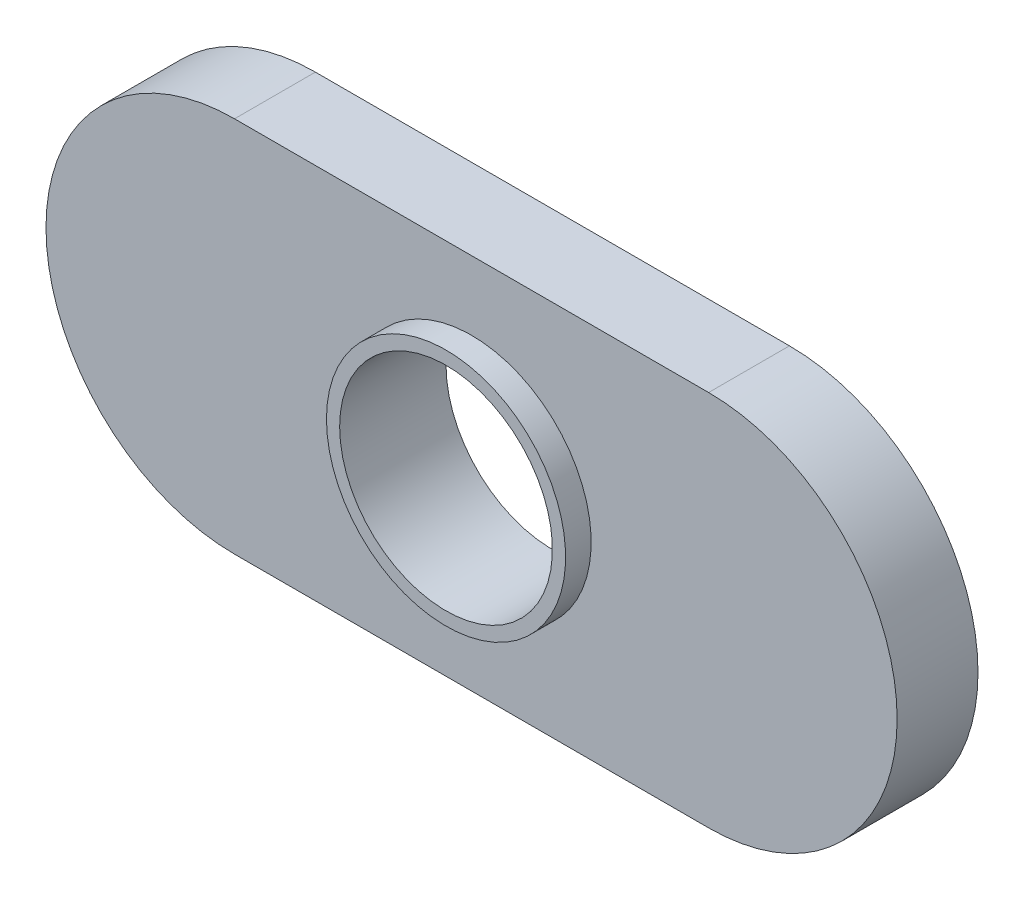
ISO-10303-21;
HEADER;
FILE_DESCRIPTION(('STEP AP214'),'2;1');
FILE_NAME('part.step','',(''),(''),'','','');
FILE_SCHEMA(('AUTOMOTIVE_DESIGN { 1 0 10303 214 1 1 1 1 }'));
ENDSEC;
DATA;
#1=APPLICATION_CONTEXT('core data for automotive mechanical design processes');
#2=APPLICATION_PROTOCOL_DEFINITION('international standard','automotive_design',2000,#1);
#3=PRODUCT_CONTEXT('',#1,'mechanical');
#4=PRODUCT('Part','Part','',(#3));
#5=PRODUCT_RELATED_PRODUCT_CATEGORY('part','',(#4));
#6=PRODUCT_DEFINITION_FORMATION('','',#4);
#7=PRODUCT_DEFINITION_CONTEXT('part definition',#1,'design');
#8=PRODUCT_DEFINITION('design','',#6,#7);
#9=PRODUCT_DEFINITION_SHAPE('','',#8);
#10=(LENGTH_UNIT() NAMED_UNIT(*) SI_UNIT(.MILLI.,.METRE.));
#11=(NAMED_UNIT(*) PLANE_ANGLE_UNIT() SI_UNIT($,.RADIAN.));
#12=(NAMED_UNIT(*) SI_UNIT($,.STERADIAN.) SOLID_ANGLE_UNIT());
#13=UNCERTAINTY_MEASURE_WITH_UNIT(LENGTH_MEASURE(1.E-05),#10,'distance_accuracy_value','');
#14=(GEOMETRIC_REPRESENTATION_CONTEXT(3) GLOBAL_UNCERTAINTY_ASSIGNED_CONTEXT((#13)) GLOBAL_UNIT_ASSIGNED_CONTEXT((#10,
#11,#12)) REPRESENTATION_CONTEXT('',''));
#15=CARTESIAN_POINT('',(0.,0.,0.));
#16=DIRECTION('',(0.,0.,1.));
#17=DIRECTION('',(1.,0.,0.));
#18=AXIS2_PLACEMENT_3D('',#15,#16,#17);
#19=CARTESIAN_POINT('',(111.278662660247,125.933065895994,2.413));
#20=DIRECTION('',(0.,0.,-1.));
#21=DIRECTION('',(-1.,0.,0.));
#22=AXIS2_PLACEMENT_3D('',#19,#20,#21);
#23=PLANE('',#22);
#24=CARTESIAN_POINT('',(111.278662660247,125.933065895994,2.413));
#25=DIRECTION('',(0.,0.,1.));
#26=DIRECTION('',(-1.,0.,0.));
#27=AXIS2_PLACEMENT_3D('',#24,#25,#26);
#28=CIRCLE('',#27,5.62609999999999);
#29=CARTESIAN_POINT('',(111.278662660247,131.559165895994,2.413));
#30=VERTEX_POINT('',#29);
#31=CARTESIAN_POINT('',(111.278662660247,120.306965895994,2.413));
#32=VERTEX_POINT('',#31);
#33=EDGE_CURVE('E86',#30,#32,#28,.T.);
#34=ORIENTED_EDGE('',*,*,#33,.T.);
#35=DIRECTION('',(1.,0.,0.));
#36=VECTOR('',#35,1.);
#37=CARTESIAN_POINT('',(111.278662660247,120.306965895994,2.413));
#38=LINE('',#37,#36);
#39=CARTESIAN_POINT('',(125.426462660247,120.306965895994,2.413));
#40=VERTEX_POINT('',#39);
#41=EDGE_CURVE('E81',#32,#40,#38,.T.);
#42=ORIENTED_EDGE('',*,*,#41,.T.);
#43=CARTESIAN_POINT('',(125.426462660247,125.933065895994,2.413));
#44=DIRECTION('',(0.,0.,1.));
#45=DIRECTION('',(1.,0.,0.));
#46=AXIS2_PLACEMENT_3D('',#43,#44,#45);
#47=CIRCLE('',#46,5.62609999999999);
#48=CARTESIAN_POINT('',(125.426462660247,131.559165895994,2.413));
#49=VERTEX_POINT('',#48);
#50=EDGE_CURVE('E84',#40,#49,#47,.T.);
#51=ORIENTED_EDGE('',*,*,#50,.T.);
#52=DIRECTION('',(-1.,0.,0.));
#53=VECTOR('',#52,1.);
#54=CARTESIAN_POINT('',(111.278662660247,131.559165895994,2.413));
#55=LINE('',#54,#53);
#56=EDGE_CURVE('E50',#49,#30,#55,.T.);
#57=ORIENTED_EDGE('',*,*,#56,.T.);
#58=EDGE_LOOP('',(#34,#42,#51,#57));
#59=FACE_BOUND('',#58,.T.);
#60=CARTESIAN_POINT('',(118.352562660247,125.933065895994,2.413));
#61=DIRECTION('',(0.,0.,-1.));
#62=DIRECTION('',(-1.,0.,0.));
#63=AXIS2_PLACEMENT_3D('',#60,#61,#62);
#64=CIRCLE('',#63,3.5687);
#65=CARTESIAN_POINT('',(114.783862660247,125.933065895994,2.413));
#66=VERTEX_POINT('',#65);
#67=EDGE_CURVE('E11',#66,#66,#64,.F.);
#68=ORIENTED_EDGE('',*,*,#67,.F.);
#69=EDGE_LOOP('',(#68));
#70=FACE_BOUND('',#69,.T.);
#71=ADVANCED_FACE('F33',(#59,#70),#23,.F.);
#72=CARTESIAN_POINT('',(111.278662660247,125.933065895994,2.413));
#73=DIRECTION('',(0.,0.,-1.));
#74=DIRECTION('',(-1.,0.,0.));
#75=AXIS2_PLACEMENT_3D('',#72,#73,#74);
#76=CYLINDRICAL_SURFACE('',#75,5.62609999999999);
#77=CARTESIAN_POINT('',(111.278662660247,125.933065895994,0.));
#78=DIRECTION('',(0.,0.,1.));
#79=DIRECTION('',(-1.,0.,0.));
#80=AXIS2_PLACEMENT_3D('',#77,#78,#79);
#81=CIRCLE('',#80,5.62609999999999);
#82=CARTESIAN_POINT('',(111.278662660247,131.559165895994,0.));
#83=VERTEX_POINT('',#82);
#84=CARTESIAN_POINT('',(111.278662660247,120.306965895994,0.));
#85=VERTEX_POINT('',#84);
#86=EDGE_CURVE('E100',#83,#85,#81,.T.);
#87=ORIENTED_EDGE('',*,*,#86,.T.);
#88=DIRECTION('',(0.,0.,-1.));
#89=VECTOR('',#88,1.);
#90=CARTESIAN_POINT('',(111.278662660247,120.306965895994,2.413));
#91=LINE('',#90,#89);
#92=EDGE_CURVE('E42',#32,#85,#91,.T.);
#93=ORIENTED_EDGE('',*,*,#92,.F.);
#94=ORIENTED_EDGE('',*,*,#33,.F.);
#95=DIRECTION('',(0.,0.,-1.));
#96=VECTOR('',#95,1.);
#97=CARTESIAN_POINT('',(111.278662660247,131.559165895994,2.413));
#98=LINE('',#97,#96);
#99=EDGE_CURVE('E96',#30,#83,#98,.T.);
#100=ORIENTED_EDGE('',*,*,#99,.T.);
#101=EDGE_LOOP('',(#87,#93,#94,#100));
#102=FACE_BOUND('',#101,.T.);
#103=ADVANCED_FACE('F35',(#102),#76,.T.);
#104=CARTESIAN_POINT('',(111.278662660247,120.306965895994,2.413));
#105=DIRECTION('',(0.,1.,0.));
#106=DIRECTION('',(0.,0.,1.));
#107=AXIS2_PLACEMENT_3D('',#104,#105,#106);
#108=PLANE('',#107);
#109=DIRECTION('',(1.,0.,0.));
#110=VECTOR('',#109,1.);
#111=CARTESIAN_POINT('',(111.278662660247,120.306965895994,0.));
#112=LINE('',#111,#110);
#113=CARTESIAN_POINT('',(125.426462660247,120.306965895994,0.));
#114=VERTEX_POINT('',#113);
#115=EDGE_CURVE('E91',#85,#114,#112,.T.);
#116=ORIENTED_EDGE('',*,*,#115,.T.);
#117=DIRECTION('',(0.,0.,-1.));
#118=VECTOR('',#117,1.);
#119=CARTESIAN_POINT('',(125.426462660247,120.306965895994,2.413));
#120=LINE('',#119,#118);
#121=EDGE_CURVE('E89',#40,#114,#120,.T.);
#122=ORIENTED_EDGE('',*,*,#121,.F.);
#123=ORIENTED_EDGE('',*,*,#41,.F.);
#124=ORIENTED_EDGE('',*,*,#92,.T.);
#125=EDGE_LOOP('',(#116,#122,#123,#124));
#126=FACE_BOUND('',#125,.T.);
#127=ADVANCED_FACE('F90',(#126),#108,.F.);
#128=CARTESIAN_POINT('',(125.426462660247,125.933065895994,2.413));
#129=DIRECTION('',(0.,0.,-1.));
#130=DIRECTION('',(-1.,0.,0.));
#131=AXIS2_PLACEMENT_3D('',#128,#129,#130);
#132=CYLINDRICAL_SURFACE('',#131,5.62609999999999);
#133=CARTESIAN_POINT('',(125.426462660247,125.933065895994,0.));
#134=DIRECTION('',(0.,0.,1.));
#135=DIRECTION('',(1.,0.,0.));
#136=AXIS2_PLACEMENT_3D('',#133,#134,#135);
#137=CIRCLE('',#136,5.62609999999999);
#138=CARTESIAN_POINT('',(125.426462660247,131.559165895994,0.));
#139=VERTEX_POINT('',#138);
#140=EDGE_CURVE('E67',#114,#139,#137,.T.);
#141=ORIENTED_EDGE('',*,*,#140,.T.);
#142=DIRECTION('',(0.,0.,-1.));
#143=VECTOR('',#142,1.);
#144=CARTESIAN_POINT('',(125.426462660247,131.559165895994,2.413));
#145=LINE('',#144,#143);
#146=EDGE_CURVE('E92',#49,#139,#145,.T.);
#147=ORIENTED_EDGE('',*,*,#146,.F.);
#148=ORIENTED_EDGE('',*,*,#50,.F.);
#149=ORIENTED_EDGE('',*,*,#121,.T.);
#150=EDGE_LOOP('',(#141,#147,#148,#149));
#151=FACE_BOUND('',#150,.T.);
#152=ADVANCED_FACE('F94',(#151),#132,.T.);
#153=CARTESIAN_POINT('',(111.278662660247,131.559165895994,2.413));
#154=DIRECTION('',(0.,-1.,0.));
#155=DIRECTION('',(0.,0.,-1.));
#156=AXIS2_PLACEMENT_3D('',#153,#154,#155);
#157=PLANE('',#156);
#158=DIRECTION('',(-1.,0.,0.));
#159=VECTOR('',#158,1.);
#160=CARTESIAN_POINT('',(111.278662660247,131.559165895994,0.));
#161=LINE('',#160,#159);
#162=EDGE_CURVE('E73',#139,#83,#161,.T.);
#163=ORIENTED_EDGE('',*,*,#162,.T.);
#164=ORIENTED_EDGE('',*,*,#99,.F.);
#165=ORIENTED_EDGE('',*,*,#56,.F.);
#166=ORIENTED_EDGE('',*,*,#146,.T.);
#167=EDGE_LOOP('',(#163,#164,#165,#166));
#168=FACE_BOUND('',#167,.T.);
#169=ADVANCED_FACE('F114',(#168),#157,.F.);
#170=CARTESIAN_POINT('',(111.278662660247,125.933065895994,0.));
#171=DIRECTION('',(0.,0.,-1.));
#172=DIRECTION('',(-1.,0.,0.));
#173=AXIS2_PLACEMENT_3D('',#170,#171,#172);
#174=PLANE('',#173);
#175=CARTESIAN_POINT('',(118.352562660247,125.933065895994,0.));
#176=DIRECTION('',(0.,0.,-1.));
#177=DIRECTION('',(-1.,0.,0.));
#178=AXIS2_PLACEMENT_3D('',#175,#176,#177);
#179=CIRCLE('',#178,3.175);
#180=CARTESIAN_POINT('',(115.177562660247,125.933065895994,0.));
#181=VERTEX_POINT('',#180);
#182=EDGE_CURVE('E145',#181,#181,#179,.T.);
#183=ORIENTED_EDGE('',*,*,#182,.F.);
#184=EDGE_LOOP('',(#183));
#185=FACE_BOUND('',#184,.T.);
#186=ORIENTED_EDGE('',*,*,#86,.F.);
#187=ORIENTED_EDGE('',*,*,#162,.F.);
#188=ORIENTED_EDGE('',*,*,#140,.F.);
#189=ORIENTED_EDGE('',*,*,#115,.F.);
#190=EDGE_LOOP('',(#186,#187,#188,#189));
#191=FACE_BOUND('',#190,.T.);
#192=ADVANCED_FACE('F111',(#185,#191),#174,.T.);
#193=CARTESIAN_POINT('',(118.352562660247,125.933065895994,3.175));
#194=DIRECTION('',(0.,0.,-1.));
#195=DIRECTION('',(-1.,0.,0.));
#196=AXIS2_PLACEMENT_3D('',#193,#194,#195);
#197=CYLINDRICAL_SURFACE('',#196,3.5687);
#198=CARTESIAN_POINT('',(118.352562660247,125.933065895994,3.175));
#199=DIRECTION('',(0.,0.,1.));
#200=DIRECTION('',(1.,0.,0.));
#201=AXIS2_PLACEMENT_3D('',#198,#199,#200);
#202=CIRCLE('',#201,3.5687);
#203=CARTESIAN_POINT('',(114.783862660247,125.933065895994,3.175));
#204=VERTEX_POINT('',#203);
#205=EDGE_CURVE('E103',#204,#204,#202,.T.);
#206=CARTESIAN_POINT('',(114.783862660247,125.933065895994,3.175));
#207=CARTESIAN_POINT('',(114.783862660247,125.933065895994,3.1670625));
#208=CARTESIAN_POINT('',(114.783862660247,125.933065895994,3.159125));
#209=CARTESIAN_POINT('',(114.783862660247,125.933065895994,3.14325));
#210=CARTESIAN_POINT('',(114.783862660247,125.933065895994,3.1353125));
#211=CARTESIAN_POINT('',(114.783862660247,125.933065895994,3.1194375));
#212=CARTESIAN_POINT('',(114.783862660247,125.933065895994,3.1115));
#213=CARTESIAN_POINT('',(114.783862660247,125.933065895994,3.095625));
#214=CARTESIAN_POINT('',(114.783862660247,125.933065895994,3.0876875));
#215=CARTESIAN_POINT('',(114.783862660247,125.933065895994,3.0718125));
#216=CARTESIAN_POINT('',(114.783862660247,125.933065895994,3.063875));
#217=CARTESIAN_POINT('',(114.783862660247,125.933065895994,3.048));
#218=CARTESIAN_POINT('',(114.783862660247,125.933065895994,3.0400625));
#219=CARTESIAN_POINT('',(114.783862660247,125.933065895994,3.0241875));
#220=CARTESIAN_POINT('',(114.783862660247,125.933065895994,3.01625));
#221=CARTESIAN_POINT('',(114.783862660247,125.933065895994,3.000375));
#222=CARTESIAN_POINT('',(114.783862660247,125.933065895994,2.9924375));
#223=CARTESIAN_POINT('',(114.783862660247,125.933065895994,2.9765625));
#224=CARTESIAN_POINT('',(114.783862660247,125.933065895994,2.968625));
#225=CARTESIAN_POINT('',(114.783862660247,125.933065895994,2.95275));
#226=CARTESIAN_POINT('',(114.783862660247,125.933065895994,2.9448125));
#227=CARTESIAN_POINT('',(114.783862660247,125.933065895994,2.9289375));
#228=CARTESIAN_POINT('',(114.783862660247,125.933065895994,2.921));
#229=CARTESIAN_POINT('',(114.783862660247,125.933065895994,2.905125));
#230=CARTESIAN_POINT('',(114.783862660247,125.933065895994,2.8971875));
#231=CARTESIAN_POINT('',(114.783862660247,125.933065895994,2.8813125));
#232=CARTESIAN_POINT('',(114.783862660247,125.933065895994,2.873375));
#233=CARTESIAN_POINT('',(114.783862660247,125.933065895994,2.8575));
#234=CARTESIAN_POINT('',(114.783862660247,125.933065895994,2.8495625));
#235=CARTESIAN_POINT('',(114.783862660247,125.933065895994,2.8336875));
#236=CARTESIAN_POINT('',(114.783862660247,125.933065895994,2.82575));
#237=CARTESIAN_POINT('',(114.783862660247,125.933065895994,2.809875));
#238=CARTESIAN_POINT('',(114.783862660247,125.933065895994,2.8019375));
#239=CARTESIAN_POINT('',(114.783862660247,125.933065895994,2.7860625));
#240=CARTESIAN_POINT('',(114.783862660247,125.933065895994,2.778125));
#241=CARTESIAN_POINT('',(114.783862660247,125.933065895994,2.76225));
#242=CARTESIAN_POINT('',(114.783862660247,125.933065895994,2.7543125));
#243=CARTESIAN_POINT('',(114.783862660247,125.933065895994,2.7384375));
#244=CARTESIAN_POINT('',(114.783862660247,125.933065895994,2.7305));
#245=CARTESIAN_POINT('',(114.783862660247,125.933065895994,2.714625));
#246=CARTESIAN_POINT('',(114.783862660247,125.933065895994,2.7066875));
#247=CARTESIAN_POINT('',(114.783862660247,125.933065895994,2.6908125));
#248=CARTESIAN_POINT('',(114.783862660247,125.933065895994,2.682875));
#249=CARTESIAN_POINT('',(114.783862660247,125.933065895994,2.667));
#250=CARTESIAN_POINT('',(114.783862660247,125.933065895994,2.6590625));
#251=CARTESIAN_POINT('',(114.783862660247,125.933065895994,2.6431875));
#252=CARTESIAN_POINT('',(114.783862660247,125.933065895994,2.63525));
#253=CARTESIAN_POINT('',(114.783862660247,125.933065895994,2.619375));
#254=CARTESIAN_POINT('',(114.783862660247,125.933065895994,2.6114375));
#255=CARTESIAN_POINT('',(114.783862660247,125.933065895994,2.5955625));
#256=CARTESIAN_POINT('',(114.783862660247,125.933065895994,2.587625));
#257=CARTESIAN_POINT('',(114.783862660247,125.933065895994,2.57175));
#258=CARTESIAN_POINT('',(114.783862660247,125.933065895994,2.5638125));
#259=CARTESIAN_POINT('',(114.783862660247,125.933065895994,2.5479375));
#260=CARTESIAN_POINT('',(114.783862660247,125.933065895994,2.54));
#261=CARTESIAN_POINT('',(114.783862660247,125.933065895994,2.524125));
#262=CARTESIAN_POINT('',(114.783862660247,125.933065895994,2.5161875));
#263=CARTESIAN_POINT('',(114.783862660247,125.933065895994,2.5003125));
#264=CARTESIAN_POINT('',(114.783862660247,125.933065895994,2.492375));
#265=CARTESIAN_POINT('',(114.783862660247,125.933065895994,2.4765));
#266=CARTESIAN_POINT('',(114.783862660247,125.933065895994,2.4685625));
#267=CARTESIAN_POINT('',(114.783862660247,125.933065895994,2.4526875));
#268=CARTESIAN_POINT('',(114.783862660247,125.933065895994,2.44475));
#269=CARTESIAN_POINT('',(114.783862660247,125.933065895994,2.428875));
#270=CARTESIAN_POINT('',(114.783862660247,125.933065895994,2.4209375));
#271=CARTESIAN_POINT('',(114.783862660247,125.933065895994,2.413));
#272=B_SPLINE_CURVE_WITH_KNOTS('',3,(#206,#207,#208,#209,#210,#211,#212,#213,#214,#215,#216,
#217,#218,#219,#220,#221,#222,#223,#224,#225,#226,#227,#228,#229,#230,#231,#232,#233,#234,#235,
#236,#237,#238,#239,#240,#241,#242,#243,#244,#245,#246,#247,#248,#249,#250,#251,#252,#253,#254,
#255,#256,#257,#258,#259,#260,#261,#262,#263,#264,#265,#266,#267,#268,#269,#270,#271),
.UNSPECIFIED.,.F.,.F.,(4,2,2,2,2,2,2,2,2,2,2,2,2,2,2,2,2,2,2,2,2,2,2,2,2,2,2,2,2,2,2,2,4),(0.,
0.0238125000000004,0.0476250000000004,0.0714375000000003,0.0952500000000003,0.1190625,0.142875,
0.1666875,0.1905,0.2143125,0.238125,0.2619375,0.28575,0.3095625,0.333375,0.3571875,0.381,
0.4048125,0.428625,0.4524375,0.47625,0.5000625,0.523875,0.5476875,0.5715,0.5953125,0.619125,
0.6429375,0.66675,0.6905625,0.714375,0.7381875,0.762),.UNSPECIFIED.);
#273=EDGE_CURVE('BSEAM113',#204,#66,#272,.T.);
#274=ORIENTED_EDGE('',*,*,#205,.F.);
#275=ORIENTED_EDGE('',*,*,#67,.T.);
#276=ORIENTED_EDGE('',*,*,#273,.T.);
#277=ORIENTED_EDGE('',*,*,#273,.F.);
#278=EDGE_LOOP('',(#274,#276,#275,#277));
#279=FACE_BOUND('',#278,.T.);
#280=ADVANCED_FACE('F113',(#279),#197,.T.);
#281=CARTESIAN_POINT('',(118.352562660247,125.933065895994,3.175));
#282=DIRECTION('',(0.,0.,1.));
#283=DIRECTION('',(1.,0.,0.));
#284=AXIS2_PLACEMENT_3D('',#281,#282,#283);
#285=PLANE('',#284);
#286=CARTESIAN_POINT('',(118.352562660247,125.933065895994,3.175));
#287=DIRECTION('',(0.,0.,-1.));
#288=DIRECTION('',(-1.,0.,0.));
#289=AXIS2_PLACEMENT_3D('',#286,#287,#288);
#290=CIRCLE('',#289,3.175);
#291=CARTESIAN_POINT('',(115.177562660247,125.933065895994,3.175));
#292=VERTEX_POINT('',#291);
#293=EDGE_CURVE('E143',#292,#292,#290,.T.);
#294=ORIENTED_EDGE('',*,*,#293,.T.);
#295=EDGE_LOOP('',(#294));
#296=FACE_BOUND('',#295,.T.);
#297=ORIENTED_EDGE('',*,*,#205,.T.);
#298=EDGE_LOOP('',(#297));
#299=FACE_BOUND('',#298,.T.);
#300=ADVANCED_FACE('F121',(#296,#299),#285,.T.);
#301=CARTESIAN_POINT('',(118.352562660247,125.933065895994,3.175));
#302=DIRECTION('',(0.,0.,-1.));
#303=DIRECTION('',(-1.,0.,0.));
#304=AXIS2_PLACEMENT_3D('',#301,#302,#303);
#305=CYLINDRICAL_SURFACE('',#304,3.175);
#306=ORIENTED_EDGE('',*,*,#293,.F.);
#307=EDGE_LOOP('',(#306));
#308=FACE_BOUND('',#307,.T.);
#309=ORIENTED_EDGE('',*,*,#182,.T.);
#310=EDGE_LOOP('',(#309));
#311=FACE_BOUND('',#310,.T.);
#312=ADVANCED_FACE('F134',(#308,#311),#305,.F.);
#313=CLOSED_SHELL('',(#71,#103,#127,#152,#169,#192,#280,#300,#312));
#314=MANIFOLD_SOLID_BREP('B2',#313);
#315=ADVANCED_BREP_SHAPE_REPRESENTATION('',(#18,#314),#14);
#316=SHAPE_DEFINITION_REPRESENTATION(#9,#315);
ENDSEC;
END-ISO-10303-21;
